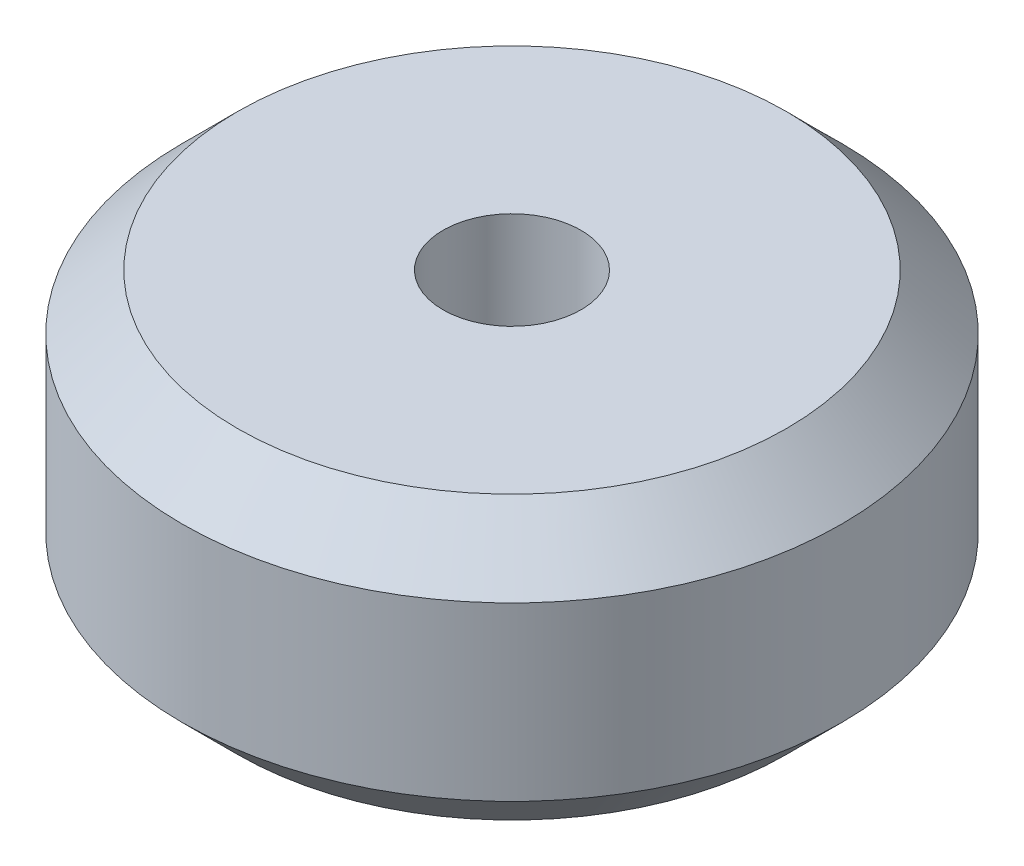
ISO-10303-21;
HEADER;
FILE_DESCRIPTION(('STEP AP214'),'2;1');
FILE_NAME('part.step','',(''),(''),'','','');
FILE_SCHEMA(('AUTOMOTIVE_DESIGN { 1 0 10303 214 1 1 1 1 }'));
ENDSEC;
DATA;
#1=APPLICATION_CONTEXT('core data for automotive mechanical design processes');
#2=APPLICATION_PROTOCOL_DEFINITION('international standard','automotive_design',2000,#1);
#3=PRODUCT_CONTEXT('',#1,'mechanical');
#4=PRODUCT('Part','Part','',(#3));
#5=PRODUCT_RELATED_PRODUCT_CATEGORY('part','',(#4));
#6=PRODUCT_DEFINITION_FORMATION('','',#4);
#7=PRODUCT_DEFINITION_CONTEXT('part definition',#1,'design');
#8=PRODUCT_DEFINITION('design','',#6,#7);
#9=PRODUCT_DEFINITION_SHAPE('','',#8);
#10=(LENGTH_UNIT() NAMED_UNIT(*) SI_UNIT(.MILLI.,.METRE.));
#11=(NAMED_UNIT(*) PLANE_ANGLE_UNIT() SI_UNIT($,.RADIAN.));
#12=(NAMED_UNIT(*) SI_UNIT($,.STERADIAN.) SOLID_ANGLE_UNIT());
#13=UNCERTAINTY_MEASURE_WITH_UNIT(LENGTH_MEASURE(1.E-05),#10,'distance_accuracy_value','');
#14=(GEOMETRIC_REPRESENTATION_CONTEXT(3) GLOBAL_UNCERTAINTY_ASSIGNED_CONTEXT((#13)) GLOBAL_UNIT_ASSIGNED_CONTEXT((#10,
#11,#12)) REPRESENTATION_CONTEXT('',''));
#15=CARTESIAN_POINT('',(0.,0.,0.));
#16=DIRECTION('',(0.,0.,1.));
#17=DIRECTION('',(1.,0.,0.));
#18=AXIS2_PLACEMENT_3D('',#15,#16,#17);
#19=CARTESIAN_POINT('',(0.,10.23,0.));
#20=DIRECTION('',(0.,1.,0.));
#21=DIRECTION('',(0.,0.,1.));
#22=AXIS2_PLACEMENT_3D('',#19,#20,#21);
#23=PLANE('',#22);
#24=CARTESIAN_POINT('',(0.,10.23,0.));
#25=DIRECTION('',(0.,1.,0.));
#26=DIRECTION('',(0.,0.,1.));
#27=AXIS2_PLACEMENT_3D('',#24,#25,#26);
#28=CIRCLE('',#27,9.95);
#29=CARTESIAN_POINT('',(0.,10.23,9.95));
#30=VERTEX_POINT('',#29);
#31=EDGE_CURVE('E10',#30,#30,#28,.T.);
#32=ORIENTED_EDGE('',*,*,#31,.T.);
#33=EDGE_LOOP('',(#32));
#34=FACE_BOUND('',#33,.T.);
#35=CARTESIAN_POINT('',(0.,10.23,0.));
#36=DIRECTION('',(0.,1.,0.));
#37=DIRECTION('',(0.,0.,1.));
#38=AXIS2_PLACEMENT_3D('',#35,#36,#37);
#39=CIRCLE('',#38,2.5);
#40=CARTESIAN_POINT('',(0.,10.23,2.5));
#41=VERTEX_POINT('',#40);
#42=EDGE_CURVE('E54',#41,#41,#39,.T.);
#43=ORIENTED_EDGE('',*,*,#42,.F.);
#44=EDGE_LOOP('',(#43));
#45=FACE_BOUND('',#44,.T.);
#46=ADVANCED_FACE('F33',(#34,#45),#23,.T.);
#47=CARTESIAN_POINT('',(0.,0.,0.));
#48=DIRECTION('',(0.,1.,0.));
#49=DIRECTION('',(0.,0.,1.));
#50=AXIS2_PLACEMENT_3D('',#47,#48,#49);
#51=PLANE('',#50);
#52=CARTESIAN_POINT('',(0.,0.,0.));
#53=DIRECTION('',(0.,1.,0.));
#54=DIRECTION('',(0.,0.,1.));
#55=AXIS2_PLACEMENT_3D('',#52,#53,#54);
#56=CIRCLE('',#55,9.95);
#57=CARTESIAN_POINT('',(0.,0.,9.95));
#58=VERTEX_POINT('',#57);
#59=EDGE_CURVE('E41',#58,#58,#56,.F.);
#60=ORIENTED_EDGE('',*,*,#59,.T.);
#61=EDGE_LOOP('',(#60));
#62=FACE_BOUND('',#61,.T.);
#63=CARTESIAN_POINT('',(0.,0.,0.));
#64=DIRECTION('',(0.,1.,0.));
#65=DIRECTION('',(0.,0.,1.));
#66=AXIS2_PLACEMENT_3D('',#63,#64,#65);
#67=CIRCLE('',#66,2.5);
#68=CARTESIAN_POINT('',(0.,0.,2.5));
#69=VERTEX_POINT('',#68);
#70=EDGE_CURVE('E55',#69,#69,#67,.T.);
#71=ORIENTED_EDGE('',*,*,#70,.T.);
#72=EDGE_LOOP('',(#71));
#73=FACE_BOUND('',#72,.T.);
#74=ADVANCED_FACE('F65',(#62,#73),#51,.F.);
#75=CARTESIAN_POINT('',(0.,10.23,0.));
#76=DIRECTION('',(0.,-1.,0.));
#77=DIRECTION('',(0.,0.,-1.));
#78=AXIS2_PLACEMENT_3D('',#75,#76,#77);
#79=CYLINDRICAL_SURFACE('',#78,11.95);
#80=CARTESIAN_POINT('',(0.,1.99999999999999,0.));
#81=DIRECTION('',(0.,1.,0.));
#82=DIRECTION('',(0.,0.,1.));
#83=AXIS2_PLACEMENT_3D('',#80,#81,#82);
#84=CIRCLE('',#83,11.95);
#85=CARTESIAN_POINT('',(0.,1.99999999999999,11.95));
#86=VERTEX_POINT('',#85);
#87=EDGE_CURVE('E45',#86,#86,#84,.T.);
#88=ORIENTED_EDGE('',*,*,#87,.T.);
#89=EDGE_LOOP('',(#88));
#90=FACE_BOUND('',#89,.T.);
#91=CARTESIAN_POINT('',(0.,8.23,0.));
#92=DIRECTION('',(0.,1.,0.));
#93=DIRECTION('',(0.,0.,1.));
#94=AXIS2_PLACEMENT_3D('',#91,#92,#93);
#95=CIRCLE('',#94,11.95);
#96=CARTESIAN_POINT('',(0.,8.23,11.95));
#97=VERTEX_POINT('',#96);
#98=EDGE_CURVE('E49',#97,#97,#95,.F.);
#99=ORIENTED_EDGE('',*,*,#98,.T.);
#100=EDGE_LOOP('',(#99));
#101=FACE_BOUND('',#100,.T.);
#102=ADVANCED_FACE('F70',(#90,#101),#79,.T.);
#103=CARTESIAN_POINT('',(0.,1.99999999999999,0.));
#104=DIRECTION('',(0.,1.,0.));
#105=DIRECTION('',(0.,0.,1.));
#106=AXIS2_PLACEMENT_3D('',#103,#104,#105);
#107=CONICAL_SURFACE('',#106,11.95,0.78539816339745);
#108=ORIENTED_EDGE('',*,*,#59,.F.);
#109=EDGE_LOOP('',(#108));
#110=FACE_BOUND('',#109,.T.);
#111=ORIENTED_EDGE('',*,*,#87,.F.);
#112=EDGE_LOOP('',(#111));
#113=FACE_BOUND('',#112,.T.);
#114=ADVANCED_FACE('F75',(#110,#113),#107,.T.);
#115=CARTESIAN_POINT('',(0.,10.23,0.));
#116=DIRECTION('',(0.,-1.,0.));
#117=DIRECTION('',(0.,0.,-1.));
#118=AXIS2_PLACEMENT_3D('',#115,#116,#117);
#119=CONICAL_SURFACE('',#118,9.95,0.785398163397446);
#120=ORIENTED_EDGE('',*,*,#98,.F.);
#121=EDGE_LOOP('',(#120));
#122=FACE_BOUND('',#121,.T.);
#123=ORIENTED_EDGE('',*,*,#31,.F.);
#124=EDGE_LOOP('',(#123));
#125=FACE_BOUND('',#124,.T.);
#126=ADVANCED_FACE('F36',(#122,#125),#119,.T.);
#127=CARTESIAN_POINT('',(0.,10.23,0.));
#128=DIRECTION('',(0.,-1.,0.));
#129=DIRECTION('',(0.,0.,-1.));
#130=AXIS2_PLACEMENT_3D('',#127,#128,#129);
#131=CYLINDRICAL_SURFACE('',#130,2.5);
#132=ORIENTED_EDGE('',*,*,#42,.T.);
#133=EDGE_LOOP('',(#132));
#134=FACE_BOUND('',#133,.T.);
#135=ORIENTED_EDGE('',*,*,#70,.F.);
#136=EDGE_LOOP('',(#135));
#137=FACE_BOUND('',#136,.T.);
#138=ADVANCED_FACE('F61',(#134,#137),#131,.F.);
#139=CLOSED_SHELL('',(#46,#74,#102,#114,#126,#138));
#140=MANIFOLD_SOLID_BREP('B2',#139);
#141=ADVANCED_BREP_SHAPE_REPRESENTATION('',(#18,#140),#14);
#142=SHAPE_DEFINITION_REPRESENTATION(#9,#141);
ENDSEC;
END-ISO-10303-21;
